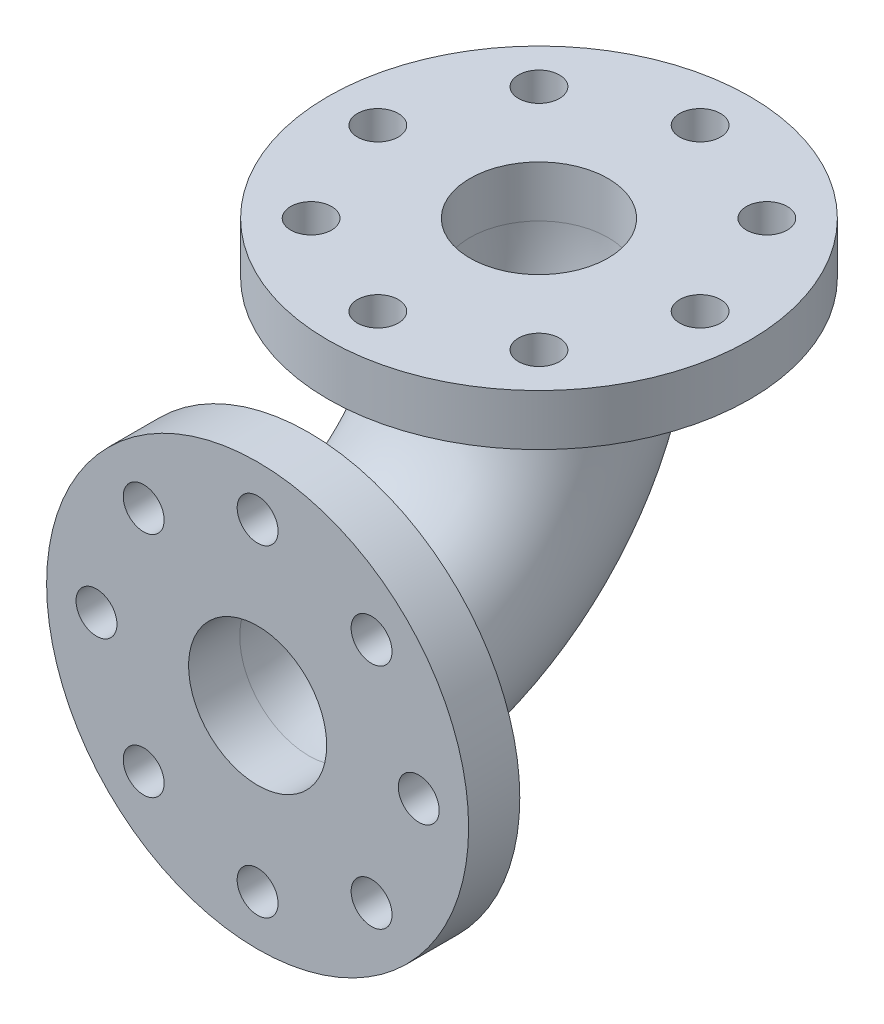
ISO-10303-21;
HEADER;
FILE_DESCRIPTION(('STEP AP214'),'2;1');
FILE_NAME('part.step','',(''),(''),'','','');
FILE_SCHEMA(('AUTOMOTIVE_DESIGN { 1 0 10303 214 1 1 1 1 }'));
ENDSEC;
DATA;
#1=APPLICATION_CONTEXT('core data for automotive mechanical design processes');
#2=APPLICATION_PROTOCOL_DEFINITION('international standard','automotive_design',2000,#1);
#3=PRODUCT_CONTEXT('',#1,'mechanical');
#4=PRODUCT('Part','Part','',(#3));
#5=PRODUCT_RELATED_PRODUCT_CATEGORY('part','',(#4));
#6=PRODUCT_DEFINITION_FORMATION('','',#4);
#7=PRODUCT_DEFINITION_CONTEXT('part definition',#1,'design');
#8=PRODUCT_DEFINITION('design','',#6,#7);
#9=PRODUCT_DEFINITION_SHAPE('','',#8);
#10=(LENGTH_UNIT() NAMED_UNIT(*) SI_UNIT(.MILLI.,.METRE.));
#11=(NAMED_UNIT(*) PLANE_ANGLE_UNIT() SI_UNIT($,.RADIAN.));
#12=(NAMED_UNIT(*) SI_UNIT($,.STERADIAN.) SOLID_ANGLE_UNIT());
#13=UNCERTAINTY_MEASURE_WITH_UNIT(LENGTH_MEASURE(1.E-05),#10,'distance_accuracy_value','');
#14=(GEOMETRIC_REPRESENTATION_CONTEXT(3) GLOBAL_UNCERTAINTY_ASSIGNED_CONTEXT((#13)) GLOBAL_UNIT_ASSIGNED_CONTEXT((#10,
#11,#12)) REPRESENTATION_CONTEXT('',''));
#15=CARTESIAN_POINT('',(0.,0.,0.));
#16=DIRECTION('',(0.,0.,1.));
#17=DIRECTION('',(1.,0.,0.));
#18=AXIS2_PLACEMENT_3D('',#15,#16,#17);
#19=CARTESIAN_POINT('',(0.,0.,20.));
#20=DIRECTION('',(0.,0.,1.));
#21=DIRECTION('',(1.,0.,0.));
#22=AXIS2_PLACEMENT_3D('',#19,#20,#21);
#23=PLANE('',#22);
#24=CARTESIAN_POINT('',(0.,63.,20.));
#25=DIRECTION('',(0.,0.,1.));
#26=DIRECTION('',(1.,0.,0.));
#27=AXIS2_PLACEMENT_3D('',#24,#25,#26);
#28=CIRCLE('',#27,8.);
#29=CARTESIAN_POINT('',(8.,63.,20.));
#30=VERTEX_POINT('',#29);
#31=EDGE_CURVE('E67',#30,#30,#28,.T.);
#32=ORIENTED_EDGE('',*,*,#31,.F.);
#33=EDGE_LOOP('',(#32));
#34=FACE_BOUND('',#33,.T.);
#35=CARTESIAN_POINT('',(44.5477272147526,44.5477272147524,20.));
#36=DIRECTION('',(0.,0.,1.));
#37=DIRECTION('',(1.,0.,0.));
#38=AXIS2_PLACEMENT_3D('',#35,#36,#37);
#39=CIRCLE('',#38,8.);
#40=CARTESIAN_POINT('',(52.5477272147526,44.5477272147524,20.));
#41=VERTEX_POINT('',#40);
#42=EDGE_CURVE('E71',#41,#41,#39,.T.);
#43=ORIENTED_EDGE('',*,*,#42,.F.);
#44=EDGE_LOOP('',(#43));
#45=FACE_BOUND('',#44,.T.);
#46=CARTESIAN_POINT('',(63.,-2.19963324347117E-13,20.));
#47=DIRECTION('',(0.,0.,1.));
#48=DIRECTION('',(1.,0.,0.));
#49=AXIS2_PLACEMENT_3D('',#46,#47,#48);
#50=CIRCLE('',#49,8.);
#51=CARTESIAN_POINT('',(71.,-2.19963324347117E-13,20.));
#52=VERTEX_POINT('',#51);
#53=EDGE_CURVE('E79',#52,#52,#50,.T.);
#54=ORIENTED_EDGE('',*,*,#53,.F.);
#55=EDGE_LOOP('',(#54));
#56=FACE_BOUND('',#55,.T.);
#57=CARTESIAN_POINT('',(44.5477272147523,-44.5477272147527,20.));
#58=DIRECTION('',(0.,0.,1.));
#59=DIRECTION('',(1.,0.,0.));
#60=AXIS2_PLACEMENT_3D('',#57,#58,#59);
#61=CIRCLE('',#60,8.);
#62=CARTESIAN_POINT('',(52.5477272147523,-44.5477272147527,20.));
#63=VERTEX_POINT('',#62);
#64=EDGE_CURVE('E87',#63,#63,#61,.T.);
#65=ORIENTED_EDGE('',*,*,#64,.F.);
#66=EDGE_LOOP('',(#65));
#67=FACE_BOUND('',#66,.T.);
#68=CARTESIAN_POINT('',(-4.39926648694235E-13,-63.,20.));
#69=DIRECTION('',(0.,0.,1.));
#70=DIRECTION('',(1.,0.,0.));
#71=AXIS2_PLACEMENT_3D('',#68,#69,#70);
#72=CIRCLE('',#71,8.);
#73=CARTESIAN_POINT('',(7.99999999999956,-63.,20.));
#74=VERTEX_POINT('',#73);
#75=EDGE_CURVE('E95',#74,#74,#72,.T.);
#76=ORIENTED_EDGE('',*,*,#75,.F.);
#77=EDGE_LOOP('',(#76));
#78=FACE_BOUND('',#77,.T.);
#79=CARTESIAN_POINT('',(-44.5477272147529,-44.5477272147521,20.));
#80=DIRECTION('',(0.,0.,1.));
#81=DIRECTION('',(1.,0.,0.));
#82=AXIS2_PLACEMENT_3D('',#79,#80,#81);
#83=CIRCLE('',#82,8.);
#84=CARTESIAN_POINT('',(-36.5477272147529,-44.5477272147521,20.));
#85=VERTEX_POINT('',#84);
#86=EDGE_CURVE('E103',#85,#85,#83,.T.);
#87=ORIENTED_EDGE('',*,*,#86,.F.);
#88=EDGE_LOOP('',(#87));
#89=FACE_BOUND('',#88,.T.);
#90=CARTESIAN_POINT('',(-63.,6.59889973041352E-13,20.));
#91=DIRECTION('',(0.,0.,1.));
#92=DIRECTION('',(1.,0.,0.));
#93=AXIS2_PLACEMENT_3D('',#90,#91,#92);
#94=CIRCLE('',#93,8.);
#95=CARTESIAN_POINT('',(-55.,6.59889973041352E-13,20.));
#96=VERTEX_POINT('',#95);
#97=EDGE_CURVE('E111',#96,#96,#94,.T.);
#98=ORIENTED_EDGE('',*,*,#97,.F.);
#99=EDGE_LOOP('',(#98));
#100=FACE_BOUND('',#99,.T.);
#101=CARTESIAN_POINT('',(-44.547727214752,44.547727214753,20.));
#102=DIRECTION('',(0.,0.,1.));
#103=DIRECTION('',(1.,0.,0.));
#104=AXIS2_PLACEMENT_3D('',#101,#102,#103);
#105=CIRCLE('',#104,8.00000000000001);
#106=CARTESIAN_POINT('',(-36.547727214752,44.547727214753,20.));
#107=VERTEX_POINT('',#106);
#108=EDGE_CURVE('E119',#107,#107,#105,.T.);
#109=ORIENTED_EDGE('',*,*,#108,.F.);
#110=EDGE_LOOP('',(#109));
#111=FACE_BOUND('',#110,.T.);
#112=CARTESIAN_POINT('',(0.,0.,20.));
#113=DIRECTION('',(0.,0.,1.));
#114=DIRECTION('',(1.,0.,0.));
#115=AXIS2_PLACEMENT_3D('',#112,#113,#114);
#116=CIRCLE('',#115,82.5);
#117=CARTESIAN_POINT('',(82.5,0.,20.));
#118=VERTEX_POINT('',#117);
#119=EDGE_CURVE('E52',#118,#118,#116,.T.);
#120=ORIENTED_EDGE('',*,*,#119,.T.);
#121=EDGE_LOOP('',(#120));
#122=FACE_BOUND('',#121,.T.);
#123=CARTESIAN_POINT('',(0.,0.,20.));
#124=DIRECTION('',(0.,0.,1.));
#125=DIRECTION('',(1.,0.,0.));
#126=AXIS2_PLACEMENT_3D('',#123,#124,#125);
#127=CIRCLE('',#126,27.);
#128=CARTESIAN_POINT('',(27.,0.,20.));
#129=VERTEX_POINT('',#128);
#130=EDGE_CURVE('E128',#129,#129,#127,.T.);
#131=ORIENTED_EDGE('',*,*,#130,.F.);
#132=EDGE_LOOP('',(#131));
#133=FACE_BOUND('',#132,.T.);
#134=ADVANCED_FACE('F43',(#34,#45,#56,#67,#78,#89,#100,#111,#122,#133),#23,.T.);
#135=CARTESIAN_POINT('',(0.,0.,0.));
#136=DIRECTION('',(0.,0.,1.));
#137=DIRECTION('',(1.,0.,0.));
#138=AXIS2_PLACEMENT_3D('',#135,#136,#137);
#139=PLANE('',#138);
#140=CARTESIAN_POINT('',(0.,0.,0.));
#141=DIRECTION('',(0.,0.,-1.));
#142=DIRECTION('',(-1.,0.,0.));
#143=AXIS2_PLACEMENT_3D('',#140,#141,#142);
#144=CIRCLE('',#143,43.);
#145=CARTESIAN_POINT('',(0.,-43.,0.));
#146=VERTEX_POINT('',#145);
#147=EDGE_CURVE('E10',#146,#146,#144,.T.);
#148=ORIENTED_EDGE('',*,*,#147,.F.);
#149=EDGE_LOOP('',(#148));
#150=FACE_BOUND('',#149,.T.);
#151=CARTESIAN_POINT('',(0.,63.,0.));
#152=DIRECTION('',(0.,0.,1.));
#153=DIRECTION('',(1.,0.,0.));
#154=AXIS2_PLACEMENT_3D('',#151,#152,#153);
#155=CIRCLE('',#154,8.);
#156=CARTESIAN_POINT('',(8.,63.,0.));
#157=VERTEX_POINT('',#156);
#158=EDGE_CURVE('E62',#157,#157,#155,.T.);
#159=ORIENTED_EDGE('',*,*,#158,.T.);
#160=EDGE_LOOP('',(#159));
#161=FACE_BOUND('',#160,.T.);
#162=CARTESIAN_POINT('',(44.5477272147526,44.5477272147524,0.));
#163=DIRECTION('',(0.,0.,1.));
#164=DIRECTION('',(1.,0.,0.));
#165=AXIS2_PLACEMENT_3D('',#162,#163,#164);
#166=CIRCLE('',#165,8.);
#167=CARTESIAN_POINT('',(52.5477272147526,44.5477272147524,0.));
#168=VERTEX_POINT('',#167);
#169=EDGE_CURVE('E75',#168,#168,#166,.T.);
#170=ORIENTED_EDGE('',*,*,#169,.T.);
#171=EDGE_LOOP('',(#170));
#172=FACE_BOUND('',#171,.T.);
#173=CARTESIAN_POINT('',(63.,-2.19963324347117E-13,0.));
#174=DIRECTION('',(0.,0.,1.));
#175=DIRECTION('',(1.,0.,0.));
#176=AXIS2_PLACEMENT_3D('',#173,#174,#175);
#177=CIRCLE('',#176,8.);
#178=CARTESIAN_POINT('',(71.,-2.19963324347117E-13,0.));
#179=VERTEX_POINT('',#178);
#180=EDGE_CURVE('E83',#179,#179,#177,.T.);
#181=ORIENTED_EDGE('',*,*,#180,.T.);
#182=EDGE_LOOP('',(#181));
#183=FACE_BOUND('',#182,.T.);
#184=CARTESIAN_POINT('',(44.5477272147523,-44.5477272147527,0.));
#185=DIRECTION('',(0.,0.,1.));
#186=DIRECTION('',(1.,0.,0.));
#187=AXIS2_PLACEMENT_3D('',#184,#185,#186);
#188=CIRCLE('',#187,8.);
#189=CARTESIAN_POINT('',(52.5477272147523,-44.5477272147527,0.));
#190=VERTEX_POINT('',#189);
#191=EDGE_CURVE('E91',#190,#190,#188,.T.);
#192=ORIENTED_EDGE('',*,*,#191,.T.);
#193=EDGE_LOOP('',(#192));
#194=FACE_BOUND('',#193,.T.);
#195=CARTESIAN_POINT('',(-4.39926648694235E-13,-63.,0.));
#196=DIRECTION('',(0.,0.,1.));
#197=DIRECTION('',(1.,0.,0.));
#198=AXIS2_PLACEMENT_3D('',#195,#196,#197);
#199=CIRCLE('',#198,8.);
#200=CARTESIAN_POINT('',(7.99999999999956,-63.,0.));
#201=VERTEX_POINT('',#200);
#202=EDGE_CURVE('E99',#201,#201,#199,.T.);
#203=ORIENTED_EDGE('',*,*,#202,.T.);
#204=EDGE_LOOP('',(#203));
#205=FACE_BOUND('',#204,.T.);
#206=CARTESIAN_POINT('',(-44.5477272147529,-44.5477272147521,0.));
#207=DIRECTION('',(0.,0.,1.));
#208=DIRECTION('',(1.,0.,0.));
#209=AXIS2_PLACEMENT_3D('',#206,#207,#208);
#210=CIRCLE('',#209,8.);
#211=CARTESIAN_POINT('',(-36.5477272147529,-44.5477272147521,0.));
#212=VERTEX_POINT('',#211);
#213=EDGE_CURVE('E107',#212,#212,#210,.T.);
#214=ORIENTED_EDGE('',*,*,#213,.T.);
#215=EDGE_LOOP('',(#214));
#216=FACE_BOUND('',#215,.T.);
#217=CARTESIAN_POINT('',(-63.,6.59889973041352E-13,0.));
#218=DIRECTION('',(0.,0.,1.));
#219=DIRECTION('',(1.,0.,0.));
#220=AXIS2_PLACEMENT_3D('',#217,#218,#219);
#221=CIRCLE('',#220,8.);
#222=CARTESIAN_POINT('',(-55.,6.59889973041352E-13,0.));
#223=VERTEX_POINT('',#222);
#224=EDGE_CURVE('E115',#223,#223,#221,.T.);
#225=ORIENTED_EDGE('',*,*,#224,.T.);
#226=EDGE_LOOP('',(#225));
#227=FACE_BOUND('',#226,.T.);
#228=CARTESIAN_POINT('',(-44.547727214752,44.547727214753,0.));
#229=DIRECTION('',(0.,0.,1.));
#230=DIRECTION('',(1.,0.,0.));
#231=AXIS2_PLACEMENT_3D('',#228,#229,#230);
#232=CIRCLE('',#231,8.00000000000001);
#233=CARTESIAN_POINT('',(-36.547727214752,44.547727214753,0.));
#234=VERTEX_POINT('',#233);
#235=EDGE_CURVE('E123',#234,#234,#232,.T.);
#236=ORIENTED_EDGE('',*,*,#235,.T.);
#237=EDGE_LOOP('',(#236));
#238=FACE_BOUND('',#237,.T.);
#239=CARTESIAN_POINT('',(0.,0.,0.));
#240=DIRECTION('',(0.,0.,1.));
#241=DIRECTION('',(1.,0.,0.));
#242=AXIS2_PLACEMENT_3D('',#239,#240,#241);
#243=CIRCLE('',#242,82.5);
#244=CARTESIAN_POINT('',(82.5,0.,0.));
#245=VERTEX_POINT('',#244);
#246=EDGE_CURVE('E47',#245,#245,#243,.T.);
#247=ORIENTED_EDGE('',*,*,#246,.F.);
#248=EDGE_LOOP('',(#247));
#249=FACE_BOUND('',#248,.T.);
#250=ADVANCED_FACE('F151',(#150,#161,#172,#183,#194,#205,#216,#227,#238,#249),#139,.F.);
#251=CARTESIAN_POINT('',(0.,0.,20.));
#252=DIRECTION('',(0.,0.,-1.));
#253=DIRECTION('',(-1.,0.,0.));
#254=AXIS2_PLACEMENT_3D('',#251,#252,#253);
#255=CYLINDRICAL_SURFACE('',#254,82.5);
#256=ORIENTED_EDGE('',*,*,#119,.F.);
#257=EDGE_LOOP('',(#256));
#258=FACE_BOUND('',#257,.T.);
#259=ORIENTED_EDGE('',*,*,#246,.T.);
#260=EDGE_LOOP('',(#259));
#261=FACE_BOUND('',#260,.T.);
#262=ADVANCED_FACE('F45',(#258,#261),#255,.T.);
#263=CARTESIAN_POINT('',(0.,0.,20.));
#264=DIRECTION('',(0.,0.,-1.));
#265=DIRECTION('',(-1.,0.,0.));
#266=AXIS2_PLACEMENT_3D('',#263,#264,#265);
#267=CYLINDRICAL_SURFACE('',#266,27.);
#268=ORIENTED_EDGE('',*,*,#130,.T.);
#269=EDGE_LOOP('',(#268));
#270=FACE_BOUND('',#269,.T.);
#271=CARTESIAN_POINT('',(0.,0.,0.));
#272=DIRECTION('',(0.,0.,1.));
#273=DIRECTION('',(1.,0.,0.));
#274=AXIS2_PLACEMENT_3D('',#271,#272,#273);
#275=CIRCLE('',#274,27.);
#276=CARTESIAN_POINT('',(0.,-27.,0.));
#277=VERTEX_POINT('',#276);
#278=EDGE_CURVE('E66',#277,#277,#275,.T.);
#279=ORIENTED_EDGE('',*,*,#278,.F.);
#280=EDGE_LOOP('',(#279));
#281=FACE_BOUND('',#280,.T.);
#282=ADVANCED_FACE('F138',(#270,#281),#267,.F.);
#283=CARTESIAN_POINT('',(-44.547727214752,44.547727214753,0.));
#284=DIRECTION('',(0.,0.,1.));
#285=DIRECTION('',(1.,0.,0.));
#286=AXIS2_PLACEMENT_3D('',#283,#284,#285);
#287=CYLINDRICAL_SURFACE('',#286,8.00000000000001);
#288=ORIENTED_EDGE('',*,*,#235,.F.);
#289=EDGE_LOOP('',(#288));
#290=FACE_BOUND('',#289,.T.);
#291=ORIENTED_EDGE('',*,*,#108,.T.);
#292=EDGE_LOOP('',(#291));
#293=FACE_BOUND('',#292,.T.);
#294=ADVANCED_FACE('F140',(#290,#293),#287,.F.);
#295=CARTESIAN_POINT('',(-63.,6.59889973041352E-13,0.));
#296=DIRECTION('',(0.,0.,1.));
#297=DIRECTION('',(1.,0.,0.));
#298=AXIS2_PLACEMENT_3D('',#295,#296,#297);
#299=CYLINDRICAL_SURFACE('',#298,8.);
#300=ORIENTED_EDGE('',*,*,#224,.F.);
#301=EDGE_LOOP('',(#300));
#302=FACE_BOUND('',#301,.T.);
#303=ORIENTED_EDGE('',*,*,#97,.T.);
#304=EDGE_LOOP('',(#303));
#305=FACE_BOUND('',#304,.T.);
#306=ADVANCED_FACE('F148',(#302,#305),#299,.F.);
#307=CARTESIAN_POINT('',(-44.5477272147529,-44.5477272147521,0.));
#308=DIRECTION('',(0.,0.,1.));
#309=DIRECTION('',(1.,0.,0.));
#310=AXIS2_PLACEMENT_3D('',#307,#308,#309);
#311=CYLINDRICAL_SURFACE('',#310,8.);
#312=ORIENTED_EDGE('',*,*,#213,.F.);
#313=EDGE_LOOP('',(#312));
#314=FACE_BOUND('',#313,.T.);
#315=ORIENTED_EDGE('',*,*,#86,.T.);
#316=EDGE_LOOP('',(#315));
#317=FACE_BOUND('',#316,.T.);
#318=ADVANCED_FACE('F186',(#314,#317),#311,.F.);
#319=CARTESIAN_POINT('',(-4.39926648694235E-13,-63.,0.));
#320=DIRECTION('',(0.,0.,1.));
#321=DIRECTION('',(1.,0.,0.));
#322=AXIS2_PLACEMENT_3D('',#319,#320,#321);
#323=CYLINDRICAL_SURFACE('',#322,8.);
#324=ORIENTED_EDGE('',*,*,#202,.F.);
#325=EDGE_LOOP('',(#324));
#326=FACE_BOUND('',#325,.T.);
#327=ORIENTED_EDGE('',*,*,#75,.T.);
#328=EDGE_LOOP('',(#327));
#329=FACE_BOUND('',#328,.T.);
#330=ADVANCED_FACE('F192',(#326,#329),#323,.F.);
#331=CARTESIAN_POINT('',(44.5477272147523,-44.5477272147527,0.));
#332=DIRECTION('',(0.,0.,1.));
#333=DIRECTION('',(1.,0.,0.));
#334=AXIS2_PLACEMENT_3D('',#331,#332,#333);
#335=CYLINDRICAL_SURFACE('',#334,8.);
#336=ORIENTED_EDGE('',*,*,#191,.F.);
#337=EDGE_LOOP('',(#336));
#338=FACE_BOUND('',#337,.T.);
#339=ORIENTED_EDGE('',*,*,#64,.T.);
#340=EDGE_LOOP('',(#339));
#341=FACE_BOUND('',#340,.T.);
#342=ADVANCED_FACE('F199',(#338,#341),#335,.F.);
#343=CARTESIAN_POINT('',(63.,-2.19963324347117E-13,0.));
#344=DIRECTION('',(0.,0.,1.));
#345=DIRECTION('',(1.,0.,0.));
#346=AXIS2_PLACEMENT_3D('',#343,#344,#345);
#347=CYLINDRICAL_SURFACE('',#346,8.);
#348=ORIENTED_EDGE('',*,*,#180,.F.);
#349=EDGE_LOOP('',(#348));
#350=FACE_BOUND('',#349,.T.);
#351=ORIENTED_EDGE('',*,*,#53,.T.);
#352=EDGE_LOOP('',(#351));
#353=FACE_BOUND('',#352,.T.);
#354=ADVANCED_FACE('F203',(#350,#353),#347,.F.);
#355=CARTESIAN_POINT('',(44.5477272147526,44.5477272147524,0.));
#356=DIRECTION('',(0.,0.,1.));
#357=DIRECTION('',(1.,0.,0.));
#358=AXIS2_PLACEMENT_3D('',#355,#356,#357);
#359=CYLINDRICAL_SURFACE('',#358,8.);
#360=ORIENTED_EDGE('',*,*,#169,.F.);
#361=EDGE_LOOP('',(#360));
#362=FACE_BOUND('',#361,.T.);
#363=ORIENTED_EDGE('',*,*,#42,.T.);
#364=EDGE_LOOP('',(#363));
#365=FACE_BOUND('',#364,.T.);
#366=ADVANCED_FACE('F207',(#362,#365),#359,.F.);
#367=CARTESIAN_POINT('',(0.,63.,0.));
#368=DIRECTION('',(0.,0.,1.));
#369=DIRECTION('',(1.,0.,0.));
#370=AXIS2_PLACEMENT_3D('',#367,#368,#369);
#371=CYLINDRICAL_SURFACE('',#370,8.);
#372=ORIENTED_EDGE('',*,*,#158,.F.);
#373=EDGE_LOOP('',(#372));
#374=FACE_BOUND('',#373,.T.);
#375=ORIENTED_EDGE('',*,*,#31,.T.);
#376=EDGE_LOOP('',(#375));
#377=FACE_BOUND('',#376,.T.);
#378=ADVANCED_FACE('F211',(#374,#377),#371,.F.);
#379=CARTESIAN_POINT('',(0.,90.,0.));
#380=DIRECTION('',(1.,0.,0.));
#381=DIRECTION('',(0.,0.,-1.));
#382=AXIS2_PLACEMENT_3D('',#379,#380,#381);
#383=TOROIDAL_SURFACE('',#382,90.,43.);
#384=CARTESIAN_POINT('',(0.,90.,-90.));
#385=DIRECTION('',(0.,1.,0.));
#386=DIRECTION('',(-1.,0.,0.));
#387=AXIS2_PLACEMENT_3D('',#384,#385,#386);
#388=CIRCLE('',#387,43.);
#389=CARTESIAN_POINT('',(0.,90.,-133.));
#390=VERTEX_POINT('',#389);
#391=EDGE_CURVE('E60',#390,#390,#388,.T.);
#392=CARTESIAN_POINT('',(0.,90.,0.));
#393=DIRECTION('',(1.,0.,0.));
#394=DIRECTION('',(0.,0.,-1.));
#395=AXIS2_PLACEMENT_3D('',#392,#393,#394);
#396=CIRCLE('',#395,133.);
#397=EDGE_CURVE('',#146,#390,#396,.T.);
#398=ORIENTED_EDGE('',*,*,#147,.T.);
#399=ORIENTED_EDGE('',*,*,#391,.F.);
#400=ORIENTED_EDGE('',*,*,#397,.T.);
#401=ORIENTED_EDGE('',*,*,#397,.F.);
#402=EDGE_LOOP('',(#398,#400,#399,#401));
#403=FACE_BOUND('',#402,.T.);
#404=ADVANCED_FACE('F215',(#403),#383,.T.);
#405=CARTESIAN_POINT('',(0.,90.,0.));
#406=DIRECTION('',(1.,0.,0.));
#407=DIRECTION('',(0.,0.,-1.));
#408=AXIS2_PLACEMENT_3D('',#405,#406,#407);
#409=TOROIDAL_SURFACE('',#408,90.,27.);
#410=CARTESIAN_POINT('',(0.,90.,-90.));
#411=DIRECTION('',(0.,1.,0.));
#412=DIRECTION('',(-1.,0.,0.));
#413=AXIS2_PLACEMENT_3D('',#410,#411,#412);
#414=CIRCLE('',#413,27.);
#415=CARTESIAN_POINT('',(0.,90.,-117.));
#416=VERTEX_POINT('',#415);
#417=EDGE_CURVE('E127',#416,#416,#414,.F.);
#418=CARTESIAN_POINT('',(0.,90.,0.));
#419=DIRECTION('',(1.,0.,0.));
#420=DIRECTION('',(0.,0.,-1.));
#421=AXIS2_PLACEMENT_3D('',#418,#419,#420);
#422=CIRCLE('',#421,117.);
#423=EDGE_CURVE('',#277,#416,#422,.T.);
#424=ORIENTED_EDGE('',*,*,#278,.T.);
#425=ORIENTED_EDGE('',*,*,#417,.F.);
#426=ORIENTED_EDGE('',*,*,#423,.T.);
#427=ORIENTED_EDGE('',*,*,#423,.F.);
#428=EDGE_LOOP('',(#424,#426,#425,#427));
#429=FACE_BOUND('',#428,.T.);
#430=ADVANCED_FACE('F136',(#429),#409,.F.);
#431=CARTESIAN_POINT('',(0.,110.,-90.));
#432=DIRECTION('',(0.,-1.,0.));
#433=DIRECTION('',(0.,0.,-1.));
#434=AXIS2_PLACEMENT_3D('',#431,#432,#433);
#435=CYLINDRICAL_SURFACE('',#434,82.5);
#436=CARTESIAN_POINT('',(0.,110.,-90.));
#437=DIRECTION('',(0.,-1.,0.));
#438=DIRECTION('',(1.,0.,0.));
#439=AXIS2_PLACEMENT_3D('',#436,#437,#438);
#440=CIRCLE('',#439,82.5);
#441=CARTESIAN_POINT('',(82.5,110.,-90.));
#442=VERTEX_POINT('',#441);
#443=EDGE_CURVE('E345',#442,#442,#440,.T.);
#444=ORIENTED_EDGE('',*,*,#443,.T.);
#445=EDGE_LOOP('',(#444));
#446=FACE_BOUND('',#445,.T.);
#447=CARTESIAN_POINT('',(0.,90.,-90.));
#448=DIRECTION('',(0.,-1.,0.));
#449=DIRECTION('',(1.,0.,0.));
#450=AXIS2_PLACEMENT_3D('',#447,#448,#449);
#451=CIRCLE('',#450,82.5);
#452=CARTESIAN_POINT('',(82.5,90.,-90.));
#453=VERTEX_POINT('',#452);
#454=EDGE_CURVE('E344',#453,#453,#451,.T.);
#455=ORIENTED_EDGE('',*,*,#454,.F.);
#456=EDGE_LOOP('',(#455));
#457=FACE_BOUND('',#456,.T.);
#458=ADVANCED_FACE('F220',(#446,#457),#435,.T.);
#459=CARTESIAN_POINT('',(0.,110.,-90.));
#460=DIRECTION('',(0.,1.,0.));
#461=DIRECTION('',(1.,0.,0.));
#462=AXIS2_PLACEMENT_3D('',#459,#460,#461);
#463=PLANE('',#462);
#464=CARTESIAN_POINT('',(0.,110.,-27.));
#465=DIRECTION('',(0.,-1.,0.));
#466=DIRECTION('',(1.,0.,0.));
#467=AXIS2_PLACEMENT_3D('',#464,#465,#466);
#468=CIRCLE('',#467,8.);
#469=CARTESIAN_POINT('',(8.,110.,-27.));
#470=VERTEX_POINT('',#469);
#471=EDGE_CURVE('E278',#470,#470,#468,.T.);
#472=ORIENTED_EDGE('',*,*,#471,.T.);
#473=EDGE_LOOP('',(#472));
#474=FACE_BOUND('',#473,.T.);
#475=CARTESIAN_POINT('',(44.5477272147526,110.,-45.4522727852476));
#476=DIRECTION('',(0.,-1.,0.));
#477=DIRECTION('',(1.,0.,0.));
#478=AXIS2_PLACEMENT_3D('',#475,#476,#477);
#479=CIRCLE('',#478,8.);
#480=CARTESIAN_POINT('',(52.5477272147526,110.,-45.4522727852476));
#481=VERTEX_POINT('',#480);
#482=EDGE_CURVE('E287',#481,#481,#479,.T.);
#483=ORIENTED_EDGE('',*,*,#482,.T.);
#484=EDGE_LOOP('',(#483));
#485=FACE_BOUND('',#484,.T.);
#486=CARTESIAN_POINT('',(63.,110.,-90.0000000000002));
#487=DIRECTION('',(0.,-1.,0.));
#488=DIRECTION('',(1.,0.,0.));
#489=AXIS2_PLACEMENT_3D('',#486,#487,#488);
#490=CIRCLE('',#489,8.);
#491=CARTESIAN_POINT('',(71.,110.,-90.0000000000002));
#492=VERTEX_POINT('',#491);
#493=EDGE_CURVE('E297',#492,#492,#490,.T.);
#494=ORIENTED_EDGE('',*,*,#493,.T.);
#495=EDGE_LOOP('',(#494));
#496=FACE_BOUND('',#495,.T.);
#497=CARTESIAN_POINT('',(44.5477272147523,110.,-134.547727214753));
#498=DIRECTION('',(0.,-1.,0.));
#499=DIRECTION('',(1.,0.,0.));
#500=AXIS2_PLACEMENT_3D('',#497,#498,#499);
#501=CIRCLE('',#500,8.);
#502=CARTESIAN_POINT('',(52.5477272147523,110.,-134.547727214753));
#503=VERTEX_POINT('',#502);
#504=EDGE_CURVE('E305',#503,#503,#501,.T.);
#505=ORIENTED_EDGE('',*,*,#504,.T.);
#506=EDGE_LOOP('',(#505));
#507=FACE_BOUND('',#506,.T.);
#508=CARTESIAN_POINT('',(-4.39926648694235E-13,110.,-153.));
#509=DIRECTION('',(0.,-1.,0.));
#510=DIRECTION('',(1.,0.,0.));
#511=AXIS2_PLACEMENT_3D('',#508,#509,#510);
#512=CIRCLE('',#511,8.);
#513=CARTESIAN_POINT('',(7.99999999999956,110.,-153.));
#514=VERTEX_POINT('',#513);
#515=EDGE_CURVE('E313',#514,#514,#512,.T.);
#516=ORIENTED_EDGE('',*,*,#515,.T.);
#517=EDGE_LOOP('',(#516));
#518=FACE_BOUND('',#517,.T.);
#519=CARTESIAN_POINT('',(-44.5477272147529,110.,-134.547727214752));
#520=DIRECTION('',(0.,-1.,0.));
#521=DIRECTION('',(1.,0.,0.));
#522=AXIS2_PLACEMENT_3D('',#519,#520,#521);
#523=CIRCLE('',#522,8.);
#524=CARTESIAN_POINT('',(-36.5477272147529,110.,-134.547727214752));
#525=VERTEX_POINT('',#524);
#526=EDGE_CURVE('E321',#525,#525,#523,.T.);
#527=ORIENTED_EDGE('',*,*,#526,.T.);
#528=EDGE_LOOP('',(#527));
#529=FACE_BOUND('',#528,.T.);
#530=CARTESIAN_POINT('',(-63.,110.,-89.9999999999993));
#531=DIRECTION('',(0.,-1.,0.));
#532=DIRECTION('',(1.,0.,0.));
#533=AXIS2_PLACEMENT_3D('',#530,#531,#532);
#534=CIRCLE('',#533,8.);
#535=CARTESIAN_POINT('',(-55.,110.,-89.9999999999993));
#536=VERTEX_POINT('',#535);
#537=EDGE_CURVE('E329',#536,#536,#534,.T.);
#538=ORIENTED_EDGE('',*,*,#537,.T.);
#539=EDGE_LOOP('',(#538));
#540=FACE_BOUND('',#539,.T.);
#541=CARTESIAN_POINT('',(-44.547727214752,110.,-45.4522727852469));
#542=DIRECTION('',(0.,-1.,0.));
#543=DIRECTION('',(1.,0.,0.));
#544=AXIS2_PLACEMENT_3D('',#541,#542,#543);
#545=CIRCLE('',#544,8.00000000000001);
#546=CARTESIAN_POINT('',(-36.547727214752,110.,-45.4522727852469));
#547=VERTEX_POINT('',#546);
#548=EDGE_CURVE('E337',#547,#547,#545,.T.);
#549=ORIENTED_EDGE('',*,*,#548,.T.);
#550=EDGE_LOOP('',(#549));
#551=FACE_BOUND('',#550,.T.);
#552=CARTESIAN_POINT('',(0.,110.,-90.));
#553=DIRECTION('',(0.,-1.,0.));
#554=DIRECTION('',(1.,0.,0.));
#555=AXIS2_PLACEMENT_3D('',#552,#553,#554);
#556=CIRCLE('',#555,27.);
#557=CARTESIAN_POINT('',(27.,110.,-90.));
#558=VERTEX_POINT('',#557);
#559=EDGE_CURVE('E284',#558,#558,#556,.T.);
#560=ORIENTED_EDGE('',*,*,#559,.T.);
#561=EDGE_LOOP('',(#560));
#562=FACE_BOUND('',#561,.T.);
#563=ORIENTED_EDGE('',*,*,#443,.F.);
#564=EDGE_LOOP('',(#563));
#565=FACE_BOUND('',#564,.T.);
#566=ADVANCED_FACE('F226',(#474,#485,#496,#507,#518,#529,#540,#551,#562,#565),#463,.T.);
#567=CARTESIAN_POINT('',(0.,90.,-90.));
#568=DIRECTION('',(0.,1.,0.));
#569=DIRECTION('',(1.,0.,0.));
#570=AXIS2_PLACEMENT_3D('',#567,#568,#569);
#571=PLANE('',#570);
#572=CARTESIAN_POINT('',(0.,90.,-27.));
#573=DIRECTION('',(0.,-1.,0.));
#574=DIRECTION('',(1.,0.,0.));
#575=AXIS2_PLACEMENT_3D('',#572,#573,#574);
#576=CIRCLE('',#575,8.);
#577=CARTESIAN_POINT('',(8.,90.,-27.));
#578=VERTEX_POINT('',#577);
#579=EDGE_CURVE('E275',#578,#578,#576,.T.);
#580=ORIENTED_EDGE('',*,*,#579,.F.);
#581=EDGE_LOOP('',(#580));
#582=FACE_BOUND('',#581,.T.);
#583=CARTESIAN_POINT('',(44.5477272147526,90.,-45.4522727852476));
#584=DIRECTION('',(0.,-1.,0.));
#585=DIRECTION('',(1.,0.,0.));
#586=AXIS2_PLACEMENT_3D('',#583,#584,#585);
#587=CIRCLE('',#586,8.);
#588=CARTESIAN_POINT('',(52.5477272147526,90.,-45.4522727852476));
#589=VERTEX_POINT('',#588);
#590=EDGE_CURVE('E280',#589,#589,#587,.T.);
#591=ORIENTED_EDGE('',*,*,#590,.F.);
#592=EDGE_LOOP('',(#591));
#593=FACE_BOUND('',#592,.T.);
#594=CARTESIAN_POINT('',(63.,90.,-90.0000000000002));
#595=DIRECTION('',(0.,-1.,0.));
#596=DIRECTION('',(1.,0.,0.));
#597=AXIS2_PLACEMENT_3D('',#594,#595,#596);
#598=CIRCLE('',#597,8.);
#599=CARTESIAN_POINT('',(71.,90.,-90.0000000000002));
#600=VERTEX_POINT('',#599);
#601=EDGE_CURVE('E293',#600,#600,#598,.T.);
#602=ORIENTED_EDGE('',*,*,#601,.F.);
#603=EDGE_LOOP('',(#602));
#604=FACE_BOUND('',#603,.T.);
#605=CARTESIAN_POINT('',(44.5477272147523,90.,-134.547727214753));
#606=DIRECTION('',(0.,-1.,0.));
#607=DIRECTION('',(1.,0.,0.));
#608=AXIS2_PLACEMENT_3D('',#605,#606,#607);
#609=CIRCLE('',#608,8.);
#610=CARTESIAN_POINT('',(52.5477272147523,90.,-134.547727214753));
#611=VERTEX_POINT('',#610);
#612=EDGE_CURVE('E301',#611,#611,#609,.T.);
#613=ORIENTED_EDGE('',*,*,#612,.F.);
#614=EDGE_LOOP('',(#613));
#615=FACE_BOUND('',#614,.T.);
#616=CARTESIAN_POINT('',(-4.39926648694235E-13,90.,-153.));
#617=DIRECTION('',(0.,-1.,0.));
#618=DIRECTION('',(1.,0.,0.));
#619=AXIS2_PLACEMENT_3D('',#616,#617,#618);
#620=CIRCLE('',#619,8.);
#621=CARTESIAN_POINT('',(7.99999999999956,90.,-153.));
#622=VERTEX_POINT('',#621);
#623=EDGE_CURVE('E309',#622,#622,#620,.T.);
#624=ORIENTED_EDGE('',*,*,#623,.F.);
#625=EDGE_LOOP('',(#624));
#626=FACE_BOUND('',#625,.T.);
#627=CARTESIAN_POINT('',(-44.5477272147529,90.,-134.547727214752));
#628=DIRECTION('',(0.,-1.,0.));
#629=DIRECTION('',(1.,0.,0.));
#630=AXIS2_PLACEMENT_3D('',#627,#628,#629);
#631=CIRCLE('',#630,8.);
#632=CARTESIAN_POINT('',(-36.5477272147529,90.,-134.547727214752));
#633=VERTEX_POINT('',#632);
#634=EDGE_CURVE('E317',#633,#633,#631,.T.);
#635=ORIENTED_EDGE('',*,*,#634,.F.);
#636=EDGE_LOOP('',(#635));
#637=FACE_BOUND('',#636,.T.);
#638=CARTESIAN_POINT('',(-63.,90.,-89.9999999999993));
#639=DIRECTION('',(0.,-1.,0.));
#640=DIRECTION('',(1.,0.,0.));
#641=AXIS2_PLACEMENT_3D('',#638,#639,#640);
#642=CIRCLE('',#641,8.);
#643=CARTESIAN_POINT('',(-55.,90.,-89.9999999999993));
#644=VERTEX_POINT('',#643);
#645=EDGE_CURVE('E325',#644,#644,#642,.T.);
#646=ORIENTED_EDGE('',*,*,#645,.F.);
#647=EDGE_LOOP('',(#646));
#648=FACE_BOUND('',#647,.T.);
#649=CARTESIAN_POINT('',(-44.547727214752,90.,-45.4522727852469));
#650=DIRECTION('',(0.,-1.,0.));
#651=DIRECTION('',(1.,0.,0.));
#652=AXIS2_PLACEMENT_3D('',#649,#650,#651);
#653=CIRCLE('',#652,8.00000000000001);
#654=CARTESIAN_POINT('',(-36.547727214752,90.,-45.4522727852469));
#655=VERTEX_POINT('',#654);
#656=EDGE_CURVE('E333',#655,#655,#653,.T.);
#657=ORIENTED_EDGE('',*,*,#656,.F.);
#658=EDGE_LOOP('',(#657));
#659=FACE_BOUND('',#658,.T.);
#660=ORIENTED_EDGE('',*,*,#391,.T.);
#661=EDGE_LOOP('',(#660));
#662=FACE_BOUND('',#661,.T.);
#663=ORIENTED_EDGE('',*,*,#454,.T.);
#664=EDGE_LOOP('',(#663));
#665=FACE_BOUND('',#664,.T.);
#666=ADVANCED_FACE('F228',(#582,#593,#604,#615,#626,#637,#648,#659,#662,#665),#571,.F.);
#667=CARTESIAN_POINT('',(0.,110.,-90.));
#668=DIRECTION('',(0.,-1.,0.));
#669=DIRECTION('',(0.,0.,-1.));
#670=AXIS2_PLACEMENT_3D('',#667,#668,#669);
#671=CYLINDRICAL_SURFACE('',#670,27.);
#672=ORIENTED_EDGE('',*,*,#559,.F.);
#673=EDGE_LOOP('',(#672));
#674=FACE_BOUND('',#673,.T.);
#675=ORIENTED_EDGE('',*,*,#417,.T.);
#676=EDGE_LOOP('',(#675));
#677=FACE_BOUND('',#676,.T.);
#678=ADVANCED_FACE('F231',(#674,#677),#671,.F.);
#679=CARTESIAN_POINT('',(-44.547727214752,90.,-45.4522727852469));
#680=DIRECTION('',(0.,1.,0.));
#681=DIRECTION('',(0.,0.,1.));
#682=AXIS2_PLACEMENT_3D('',#679,#680,#681);
#683=CYLINDRICAL_SURFACE('',#682,8.00000000000001);
#684=ORIENTED_EDGE('',*,*,#656,.T.);
#685=EDGE_LOOP('',(#684));
#686=FACE_BOUND('',#685,.T.);
#687=ORIENTED_EDGE('',*,*,#548,.F.);
#688=EDGE_LOOP('',(#687));
#689=FACE_BOUND('',#688,.T.);
#690=ADVANCED_FACE('F238',(#686,#689),#683,.F.);
#691=CARTESIAN_POINT('',(-63.,90.,-89.9999999999993));
#692=DIRECTION('',(0.,1.,0.));
#693=DIRECTION('',(0.,0.,1.));
#694=AXIS2_PLACEMENT_3D('',#691,#692,#693);
#695=CYLINDRICAL_SURFACE('',#694,8.);
#696=ORIENTED_EDGE('',*,*,#645,.T.);
#697=EDGE_LOOP('',(#696));
#698=FACE_BOUND('',#697,.T.);
#699=ORIENTED_EDGE('',*,*,#537,.F.);
#700=EDGE_LOOP('',(#699));
#701=FACE_BOUND('',#700,.T.);
#702=ADVANCED_FACE('F242',(#698,#701),#695,.F.);
#703=CARTESIAN_POINT('',(-44.5477272147529,90.,-134.547727214752));
#704=DIRECTION('',(0.,1.,0.));
#705=DIRECTION('',(0.,0.,1.));
#706=AXIS2_PLACEMENT_3D('',#703,#704,#705);
#707=CYLINDRICAL_SURFACE('',#706,8.);
#708=ORIENTED_EDGE('',*,*,#634,.T.);
#709=EDGE_LOOP('',(#708));
#710=FACE_BOUND('',#709,.T.);
#711=ORIENTED_EDGE('',*,*,#526,.F.);
#712=EDGE_LOOP('',(#711));
#713=FACE_BOUND('',#712,.T.);
#714=ADVANCED_FACE('F246',(#710,#713),#707,.F.);
#715=CARTESIAN_POINT('',(-4.39926648694235E-13,90.,-153.));
#716=DIRECTION('',(0.,1.,0.));
#717=DIRECTION('',(0.,0.,1.));
#718=AXIS2_PLACEMENT_3D('',#715,#716,#717);
#719=CYLINDRICAL_SURFACE('',#718,8.);
#720=ORIENTED_EDGE('',*,*,#623,.T.);
#721=EDGE_LOOP('',(#720));
#722=FACE_BOUND('',#721,.T.);
#723=ORIENTED_EDGE('',*,*,#515,.F.);
#724=EDGE_LOOP('',(#723));
#725=FACE_BOUND('',#724,.T.);
#726=ADVANCED_FACE('F250',(#722,#725),#719,.F.);
#727=CARTESIAN_POINT('',(44.5477272147523,90.,-134.547727214753));
#728=DIRECTION('',(0.,1.,0.));
#729=DIRECTION('',(0.,0.,1.));
#730=AXIS2_PLACEMENT_3D('',#727,#728,#729);
#731=CYLINDRICAL_SURFACE('',#730,8.);
#732=ORIENTED_EDGE('',*,*,#612,.T.);
#733=EDGE_LOOP('',(#732));
#734=FACE_BOUND('',#733,.T.);
#735=ORIENTED_EDGE('',*,*,#504,.F.);
#736=EDGE_LOOP('',(#735));
#737=FACE_BOUND('',#736,.T.);
#738=ADVANCED_FACE('F254',(#734,#737),#731,.F.);
#739=CARTESIAN_POINT('',(63.,90.,-90.0000000000002));
#740=DIRECTION('',(0.,1.,0.));
#741=DIRECTION('',(0.,0.,1.));
#742=AXIS2_PLACEMENT_3D('',#739,#740,#741);
#743=CYLINDRICAL_SURFACE('',#742,8.);
#744=ORIENTED_EDGE('',*,*,#601,.T.);
#745=EDGE_LOOP('',(#744));
#746=FACE_BOUND('',#745,.T.);
#747=ORIENTED_EDGE('',*,*,#493,.F.);
#748=EDGE_LOOP('',(#747));
#749=FACE_BOUND('',#748,.T.);
#750=ADVANCED_FACE('F258',(#746,#749),#743,.F.);
#751=CARTESIAN_POINT('',(44.5477272147526,90.,-45.4522727852476));
#752=DIRECTION('',(0.,1.,0.));
#753=DIRECTION('',(0.,0.,1.));
#754=AXIS2_PLACEMENT_3D('',#751,#752,#753);
#755=CYLINDRICAL_SURFACE('',#754,8.);
#756=ORIENTED_EDGE('',*,*,#590,.T.);
#757=EDGE_LOOP('',(#756));
#758=FACE_BOUND('',#757,.T.);
#759=ORIENTED_EDGE('',*,*,#482,.F.);
#760=EDGE_LOOP('',(#759));
#761=FACE_BOUND('',#760,.T.);
#762=ADVANCED_FACE('F262',(#758,#761),#755,.F.);
#763=CARTESIAN_POINT('',(0.,90.,-27.));
#764=DIRECTION('',(0.,1.,0.));
#765=DIRECTION('',(0.,0.,1.));
#766=AXIS2_PLACEMENT_3D('',#763,#764,#765);
#767=CYLINDRICAL_SURFACE('',#766,8.);
#768=ORIENTED_EDGE('',*,*,#579,.T.);
#769=EDGE_LOOP('',(#768));
#770=FACE_BOUND('',#769,.T.);
#771=ORIENTED_EDGE('',*,*,#471,.F.);
#772=EDGE_LOOP('',(#771));
#773=FACE_BOUND('',#772,.T.);
#774=ADVANCED_FACE('F266',(#770,#773),#767,.F.);
#775=CLOSED_SHELL('',(#134,#250,#262,#282,#294,#306,#318,#330,#342,#354,#366,#378,#404,#430,
#458,#566,#666,#678,#690,#702,#714,#726,#738,#750,#762,#774));
#776=MANIFOLD_SOLID_BREP('B2',#775);
#777=ADVANCED_BREP_SHAPE_REPRESENTATION('',(#18,#776),#14);
#778=SHAPE_DEFINITION_REPRESENTATION(#9,#777);
ENDSEC;
END-ISO-10303-21;
